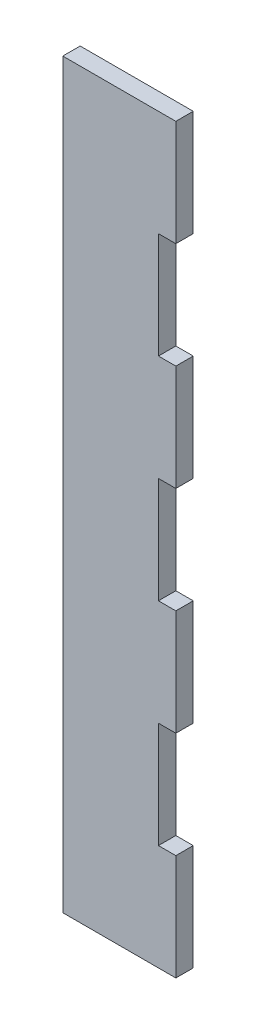
ISO-10303-21;
HEADER;
FILE_DESCRIPTION(('STEP AP214'),'2;1');
FILE_NAME('part.step','',(''),(''),'','','');
FILE_SCHEMA(('AUTOMOTIVE_DESIGN { 1 0 10303 214 1 1 1 1 }'));
ENDSEC;
DATA;
#1=APPLICATION_CONTEXT('core data for automotive mechanical design processes');
#2=APPLICATION_PROTOCOL_DEFINITION('international standard','automotive_design',2000,#1);
#3=PRODUCT_CONTEXT('',#1,'mechanical');
#4=PRODUCT('Part','Part','',(#3));
#5=PRODUCT_RELATED_PRODUCT_CATEGORY('part','',(#4));
#6=PRODUCT_DEFINITION_FORMATION('','',#4);
#7=PRODUCT_DEFINITION_CONTEXT('part definition',#1,'design');
#8=PRODUCT_DEFINITION('design','',#6,#7);
#9=PRODUCT_DEFINITION_SHAPE('','',#8);
#10=(LENGTH_UNIT() NAMED_UNIT(*) SI_UNIT(.MILLI.,.METRE.));
#11=(NAMED_UNIT(*) PLANE_ANGLE_UNIT() SI_UNIT($,.RADIAN.));
#12=(NAMED_UNIT(*) SI_UNIT($,.STERADIAN.) SOLID_ANGLE_UNIT());
#13=UNCERTAINTY_MEASURE_WITH_UNIT(LENGTH_MEASURE(1.E-05),#10,'distance_accuracy_value','');
#14=(GEOMETRIC_REPRESENTATION_CONTEXT(3) GLOBAL_UNCERTAINTY_ASSIGNED_CONTEXT((#13)) GLOBAL_UNIT_ASSIGNED_CONTEXT((#10,
#11,#12)) REPRESENTATION_CONTEXT('',''));
#15=CARTESIAN_POINT('',(0.,0.,0.));
#16=DIRECTION('',(0.,0.,1.));
#17=DIRECTION('',(1.,0.,0.));
#18=AXIS2_PLACEMENT_3D('',#15,#16,#17);
#19=CARTESIAN_POINT('',(0.,-101.6,4.7625));
#20=DIRECTION('',(0.,1.,0.));
#21=DIRECTION('',(0.,0.,1.));
#22=AXIS2_PLACEMENT_3D('',#19,#20,#21);
#23=PLANE('',#22);
#24=DIRECTION('',(1.,0.,0.));
#25=VECTOR('',#24,1.);
#26=CARTESIAN_POINT('',(0.,-101.6,0.));
#27=LINE('',#26,#25);
#28=CARTESIAN_POINT('',(-19.85,-101.6,0.));
#29=VERTEX_POINT('',#28);
#30=CARTESIAN_POINT('',(11.1125000000018,-101.6,0.));
#31=VERTEX_POINT('',#30);
#32=EDGE_CURVE('E212',#29,#31,#27,.T.);
#33=ORIENTED_EDGE('',*,*,#32,.T.);
#34=DIRECTION('',(0.,0.,-1.));
#35=VECTOR('',#34,1.);
#36=CARTESIAN_POINT('',(11.1125000000018,-101.6,4.7625));
#37=LINE('',#36,#35);
#38=CARTESIAN_POINT('',(11.1125000000018,-101.6,4.7625));
#39=VERTEX_POINT('',#38);
#40=EDGE_CURVE('E11',#39,#31,#37,.T.);
#41=ORIENTED_EDGE('',*,*,#40,.F.);
#42=DIRECTION('',(1.,0.,0.));
#43=VECTOR('',#42,1.);
#44=CARTESIAN_POINT('',(0.,-101.6,4.7625));
#45=LINE('',#44,#43);
#46=CARTESIAN_POINT('',(-19.85,-101.6,4.7625));
#47=VERTEX_POINT('',#46);
#48=EDGE_CURVE('E116',#47,#39,#45,.T.);
#49=ORIENTED_EDGE('',*,*,#48,.F.);
#50=DIRECTION('',(0.,0.,1.));
#51=VECTOR('',#50,1.);
#52=CARTESIAN_POINT('',(-19.85,-101.6,4.7625));
#53=LINE('',#52,#51);
#54=EDGE_CURVE('E208',#29,#47,#53,.T.);
#55=ORIENTED_EDGE('',*,*,#54,.F.);
#56=EDGE_LOOP('',(#33,#41,#49,#55));
#57=FACE_BOUND('',#56,.T.);
#58=ADVANCED_FACE('F41',(#57),#23,.F.);
#59=CARTESIAN_POINT('',(11.1125000000018,0.,4.7625));
#60=DIRECTION('',(1.,0.,0.));
#61=DIRECTION('',(0.,0.,-1.));
#62=AXIS2_PLACEMENT_3D('',#59,#60,#61);
#63=PLANE('',#62);
#64=DIRECTION('',(0.,-1.,0.));
#65=VECTOR('',#64,1.);
#66=CARTESIAN_POINT('',(11.1125000000018,0.,0.));
#67=LINE('',#66,#65);
#68=CARTESIAN_POINT('',(11.1125000000015,-72.5714285714286,0.));
#69=VERTEX_POINT('',#68);
#70=EDGE_CURVE('E289',#69,#31,#67,.T.);
#71=ORIENTED_EDGE('',*,*,#70,.F.);
#72=DIRECTION('',(0.,0.,-1.));
#73=VECTOR('',#72,1.);
#74=CARTESIAN_POINT('',(11.1125000000015,-72.5714285714286,4.7625));
#75=LINE('',#74,#73);
#76=CARTESIAN_POINT('',(11.1125000000015,-72.5714285714286,4.7625));
#77=VERTEX_POINT('',#76);
#78=EDGE_CURVE('E50',#77,#69,#75,.T.);
#79=ORIENTED_EDGE('',*,*,#78,.F.);
#80=DIRECTION('',(0.,-1.,0.));
#81=VECTOR('',#80,1.);
#82=CARTESIAN_POINT('',(11.1125000000018,0.,4.7625));
#83=LINE('',#82,#81);
#84=EDGE_CURVE('E198',#77,#39,#83,.T.);
#85=ORIENTED_EDGE('',*,*,#84,.T.);
#86=ORIENTED_EDGE('',*,*,#40,.T.);
#87=EDGE_LOOP('',(#71,#79,#85,#86));
#88=FACE_BOUND('',#87,.T.);
#89=ADVANCED_FACE('F290',(#88),#63,.T.);
#90=CARTESIAN_POINT('',(0.,-72.5714285714286,4.7625));
#91=DIRECTION('',(0.,1.,0.));
#92=DIRECTION('',(0.,0.,1.));
#93=AXIS2_PLACEMENT_3D('',#90,#91,#92);
#94=PLANE('',#93);
#95=DIRECTION('',(1.,0.,0.));
#96=VECTOR('',#95,1.);
#97=CARTESIAN_POINT('',(0.,-72.5714285714286,0.));
#98=LINE('',#97,#96);
#99=CARTESIAN_POINT('',(6.35,-72.5714285714286,0.));
#100=VERTEX_POINT('',#99);
#101=EDGE_CURVE('E286',#100,#69,#98,.T.);
#102=ORIENTED_EDGE('',*,*,#101,.F.);
#103=DIRECTION('',(0.,0.,-1.));
#104=VECTOR('',#103,1.);
#105=CARTESIAN_POINT('',(6.35,-72.5714285714286,4.7625));
#106=LINE('',#105,#104);
#107=CARTESIAN_POINT('',(6.35,-72.5714285714286,4.7625));
#108=VERTEX_POINT('',#107);
#109=EDGE_CURVE('E279',#108,#100,#106,.T.);
#110=ORIENTED_EDGE('',*,*,#109,.F.);
#111=DIRECTION('',(1.,0.,0.));
#112=VECTOR('',#111,1.);
#113=CARTESIAN_POINT('',(0.,-72.5714285714286,4.7625));
#114=LINE('',#113,#112);
#115=EDGE_CURVE('E191',#108,#77,#114,.T.);
#116=ORIENTED_EDGE('',*,*,#115,.T.);
#117=ORIENTED_EDGE('',*,*,#78,.T.);
#118=EDGE_LOOP('',(#102,#110,#116,#117));
#119=FACE_BOUND('',#118,.T.);
#120=ADVANCED_FACE('F284',(#119),#94,.T.);
#121=CARTESIAN_POINT('',(6.35,0.,4.7625));
#122=DIRECTION('',(1.,0.,0.));
#123=DIRECTION('',(0.,0.,-1.));
#124=AXIS2_PLACEMENT_3D('',#121,#122,#123);
#125=PLANE('',#124);
#126=DIRECTION('',(0.,-1.,0.));
#127=VECTOR('',#126,1.);
#128=CARTESIAN_POINT('',(6.35,0.,0.));
#129=LINE('',#128,#127);
#130=CARTESIAN_POINT('',(6.35,-43.5428571428572,0.));
#131=VERTEX_POINT('',#130);
#132=EDGE_CURVE('E296',#131,#100,#129,.T.);
#133=ORIENTED_EDGE('',*,*,#132,.F.);
#134=DIRECTION('',(0.,0.,-1.));
#135=VECTOR('',#134,1.);
#136=CARTESIAN_POINT('',(6.35,-43.5428571428572,4.7625));
#137=LINE('',#136,#135);
#138=CARTESIAN_POINT('',(6.35,-43.5428571428572,4.7625));
#139=VERTEX_POINT('',#138);
#140=EDGE_CURVE('E276',#139,#131,#137,.T.);
#141=ORIENTED_EDGE('',*,*,#140,.F.);
#142=DIRECTION('',(0.,-1.,0.));
#143=VECTOR('',#142,1.);
#144=CARTESIAN_POINT('',(6.35,0.,4.7625));
#145=LINE('',#144,#143);
#146=EDGE_CURVE('E178',#139,#108,#145,.T.);
#147=ORIENTED_EDGE('',*,*,#146,.T.);
#148=ORIENTED_EDGE('',*,*,#109,.T.);
#149=EDGE_LOOP('',(#133,#141,#147,#148));
#150=FACE_BOUND('',#149,.T.);
#151=ADVANCED_FACE('F349',(#150),#125,.T.);
#152=CARTESIAN_POINT('',(0.,-43.5428571428572,4.7625));
#153=DIRECTION('',(0.,1.,0.));
#154=DIRECTION('',(0.,0.,1.));
#155=AXIS2_PLACEMENT_3D('',#152,#153,#154);
#156=PLANE('',#155);
#157=DIRECTION('',(1.,0.,0.));
#158=VECTOR('',#157,1.);
#159=CARTESIAN_POINT('',(0.,-43.5428571428572,0.));
#160=LINE('',#159,#158);
#161=CARTESIAN_POINT('',(11.1125000000012,-43.5428571428572,0.));
#162=VERTEX_POINT('',#161);
#163=EDGE_CURVE('E300',#131,#162,#160,.T.);
#164=ORIENTED_EDGE('',*,*,#163,.T.);
#165=DIRECTION('',(0.,0.,-1.));
#166=VECTOR('',#165,1.);
#167=CARTESIAN_POINT('',(11.1125000000012,-43.5428571428572,4.7625));
#168=LINE('',#167,#166);
#169=CARTESIAN_POINT('',(11.1125000000012,-43.5428571428572,4.7625));
#170=VERTEX_POINT('',#169);
#171=EDGE_CURVE('E273',#170,#162,#168,.T.);
#172=ORIENTED_EDGE('',*,*,#171,.F.);
#173=DIRECTION('',(1.,0.,0.));
#174=VECTOR('',#173,1.);
#175=CARTESIAN_POINT('',(0.,-43.5428571428572,4.7625));
#176=LINE('',#175,#174);
#177=EDGE_CURVE('E190',#139,#170,#176,.T.);
#178=ORIENTED_EDGE('',*,*,#177,.F.);
#179=ORIENTED_EDGE('',*,*,#140,.T.);
#180=EDGE_LOOP('',(#164,#172,#178,#179));
#181=FACE_BOUND('',#180,.T.);
#182=ADVANCED_FACE('F351',(#181),#156,.F.);
#183=CARTESIAN_POINT('',(11.1125000000012,0.,4.7625));
#184=DIRECTION('',(1.,0.,0.));
#185=DIRECTION('',(0.,0.,-1.));
#186=AXIS2_PLACEMENT_3D('',#183,#184,#185);
#187=PLANE('',#186);
#188=DIRECTION('',(0.,-1.,0.));
#189=VECTOR('',#188,1.);
#190=CARTESIAN_POINT('',(11.1125000000012,0.,0.));
#191=LINE('',#190,#189);
#192=CARTESIAN_POINT('',(11.1125000000009,-14.5142857142858,0.));
#193=VERTEX_POINT('',#192);
#194=EDGE_CURVE('E308',#193,#162,#191,.T.);
#195=ORIENTED_EDGE('',*,*,#194,.F.);
#196=DIRECTION('',(0.,0.,-1.));
#197=VECTOR('',#196,1.);
#198=CARTESIAN_POINT('',(11.1125000000009,-14.5142857142858,4.7625));
#199=LINE('',#198,#197);
#200=CARTESIAN_POINT('',(11.1125000000009,-14.5142857142858,4.7625));
#201=VERTEX_POINT('',#200);
#202=EDGE_CURVE('E270',#201,#193,#199,.T.);
#203=ORIENTED_EDGE('',*,*,#202,.F.);
#204=DIRECTION('',(0.,-1.,0.));
#205=VECTOR('',#204,1.);
#206=CARTESIAN_POINT('',(11.1125000000012,0.,4.7625));
#207=LINE('',#206,#205);
#208=EDGE_CURVE('E196',#201,#170,#207,.T.);
#209=ORIENTED_EDGE('',*,*,#208,.T.);
#210=ORIENTED_EDGE('',*,*,#171,.T.);
#211=EDGE_LOOP('',(#195,#203,#209,#210));
#212=FACE_BOUND('',#211,.T.);
#213=ADVANCED_FACE('F346',(#212),#187,.T.);
#214=CARTESIAN_POINT('',(0.,-14.5142857142858,4.7625));
#215=DIRECTION('',(0.,1.,0.));
#216=DIRECTION('',(0.,0.,1.));
#217=AXIS2_PLACEMENT_3D('',#214,#215,#216);
#218=PLANE('',#217);
#219=DIRECTION('',(1.,0.,0.));
#220=VECTOR('',#219,1.);
#221=CARTESIAN_POINT('',(0.,-14.5142857142858,0.));
#222=LINE('',#221,#220);
#223=CARTESIAN_POINT('',(6.35,-14.5142857142858,0.));
#224=VERTEX_POINT('',#223);
#225=EDGE_CURVE('E312',#224,#193,#222,.T.);
#226=ORIENTED_EDGE('',*,*,#225,.F.);
#227=DIRECTION('',(0.,0.,-1.));
#228=VECTOR('',#227,1.);
#229=CARTESIAN_POINT('',(6.35,-14.5142857142858,4.7625));
#230=LINE('',#229,#228);
#231=CARTESIAN_POINT('',(6.35,-14.5142857142858,4.7625));
#232=VERTEX_POINT('',#231);
#233=EDGE_CURVE('E267',#232,#224,#230,.T.);
#234=ORIENTED_EDGE('',*,*,#233,.F.);
#235=DIRECTION('',(1.,0.,0.));
#236=VECTOR('',#235,1.);
#237=CARTESIAN_POINT('',(0.,-14.5142857142858,4.7625));
#238=LINE('',#237,#236);
#239=EDGE_CURVE('E187',#232,#201,#238,.T.);
#240=ORIENTED_EDGE('',*,*,#239,.T.);
#241=ORIENTED_EDGE('',*,*,#202,.T.);
#242=EDGE_LOOP('',(#226,#234,#240,#241));
#243=FACE_BOUND('',#242,.T.);
#244=ADVANCED_FACE('F341',(#243),#218,.T.);
#245=CARTESIAN_POINT('',(6.35,14.5142857142857,0.));
#246=VERTEX_POINT('',#245);
#247=EDGE_CURVE('E302',#246,#224,#129,.T.);
#248=ORIENTED_EDGE('',*,*,#247,.F.);
#249=DIRECTION('',(0.,0.,-1.));
#250=VECTOR('',#249,1.);
#251=CARTESIAN_POINT('',(6.35,14.5142857142857,4.7625));
#252=LINE('',#251,#250);
#253=CARTESIAN_POINT('',(6.35,14.5142857142857,4.7625));
#254=VERTEX_POINT('',#253);
#255=EDGE_CURVE('E264',#254,#246,#252,.T.);
#256=ORIENTED_EDGE('',*,*,#255,.F.);
#257=EDGE_CURVE('E177',#254,#232,#145,.T.);
#258=ORIENTED_EDGE('',*,*,#257,.T.);
#259=ORIENTED_EDGE('',*,*,#233,.T.);
#260=EDGE_LOOP('',(#248,#256,#258,#259));
#261=FACE_BOUND('',#260,.T.);
#262=ADVANCED_FACE('F335',(#261),#125,.T.);
#263=CARTESIAN_POINT('',(0.,14.5142857142857,4.7625));
#264=DIRECTION('',(0.,1.,0.));
#265=DIRECTION('',(0.,0.,1.));
#266=AXIS2_PLACEMENT_3D('',#263,#264,#265);
#267=PLANE('',#266);
#268=DIRECTION('',(1.,0.,0.));
#269=VECTOR('',#268,1.);
#270=CARTESIAN_POINT('',(0.,14.5142857142857,0.));
#271=LINE('',#270,#269);
#272=CARTESIAN_POINT('',(11.1125000000006,14.5142857142857,0.));
#273=VERTEX_POINT('',#272);
#274=EDGE_CURVE('E316',#246,#273,#271,.T.);
#275=ORIENTED_EDGE('',*,*,#274,.T.);
#276=DIRECTION('',(0.,0.,-1.));
#277=VECTOR('',#276,1.);
#278=CARTESIAN_POINT('',(11.1125000000006,14.5142857142857,4.7625));
#279=LINE('',#278,#277);
#280=CARTESIAN_POINT('',(11.1125000000006,14.5142857142857,4.7625));
#281=VERTEX_POINT('',#280);
#282=EDGE_CURVE('E261',#281,#273,#279,.T.);
#283=ORIENTED_EDGE('',*,*,#282,.F.);
#284=DIRECTION('',(1.,0.,0.));
#285=VECTOR('',#284,1.);
#286=CARTESIAN_POINT('',(0.,14.5142857142857,4.7625));
#287=LINE('',#286,#285);
#288=EDGE_CURVE('E186',#254,#281,#287,.T.);
#289=ORIENTED_EDGE('',*,*,#288,.F.);
#290=ORIENTED_EDGE('',*,*,#255,.T.);
#291=EDGE_LOOP('',(#275,#283,#289,#290));
#292=FACE_BOUND('',#291,.T.);
#293=ADVANCED_FACE('F383',(#292),#267,.F.);
#294=CARTESIAN_POINT('',(11.1125000000006,0.,4.7625));
#295=DIRECTION('',(1.,0.,0.));
#296=DIRECTION('',(0.,0.,-1.));
#297=AXIS2_PLACEMENT_3D('',#294,#295,#296);
#298=PLANE('',#297);
#299=DIRECTION('',(0.,-1.,0.));
#300=VECTOR('',#299,1.);
#301=CARTESIAN_POINT('',(11.1125000000006,0.,0.));
#302=LINE('',#301,#300);
#303=CARTESIAN_POINT('',(11.1125000000003,43.5428571428571,0.));
#304=VERTEX_POINT('',#303);
#305=EDGE_CURVE('E320',#304,#273,#302,.T.);
#306=ORIENTED_EDGE('',*,*,#305,.F.);
#307=DIRECTION('',(0.,0.,-1.));
#308=VECTOR('',#307,1.);
#309=CARTESIAN_POINT('',(11.1125000000003,43.5428571428571,4.7625));
#310=LINE('',#309,#308);
#311=CARTESIAN_POINT('',(11.1125000000003,43.5428571428571,4.7625));
#312=VERTEX_POINT('',#311);
#313=EDGE_CURVE('E258',#312,#304,#310,.T.);
#314=ORIENTED_EDGE('',*,*,#313,.F.);
#315=DIRECTION('',(0.,-1.,0.));
#316=VECTOR('',#315,1.);
#317=CARTESIAN_POINT('',(11.1125000000006,0.,4.7625));
#318=LINE('',#317,#316);
#319=EDGE_CURVE('E180',#312,#281,#318,.T.);
#320=ORIENTED_EDGE('',*,*,#319,.T.);
#321=ORIENTED_EDGE('',*,*,#282,.T.);
#322=EDGE_LOOP('',(#306,#314,#320,#321));
#323=FACE_BOUND('',#322,.T.);
#324=ADVANCED_FACE('F386',(#323),#298,.T.);
#325=CARTESIAN_POINT('',(0.,43.5428571428571,4.7625));
#326=DIRECTION('',(0.,1.,0.));
#327=DIRECTION('',(0.,0.,1.));
#328=AXIS2_PLACEMENT_3D('',#325,#326,#327);
#329=PLANE('',#328);
#330=DIRECTION('',(1.,0.,0.));
#331=VECTOR('',#330,1.);
#332=CARTESIAN_POINT('',(0.,43.5428571428571,0.));
#333=LINE('',#332,#331);
#334=CARTESIAN_POINT('',(6.35,43.5428571428571,0.));
#335=VERTEX_POINT('',#334);
#336=EDGE_CURVE('E324',#335,#304,#333,.T.);
#337=ORIENTED_EDGE('',*,*,#336,.F.);
#338=DIRECTION('',(0.,0.,-1.));
#339=VECTOR('',#338,1.);
#340=CARTESIAN_POINT('',(6.35,43.5428571428571,4.7625));
#341=LINE('',#340,#339);
#342=CARTESIAN_POINT('',(6.35,43.5428571428571,4.7625));
#343=VERTEX_POINT('',#342);
#344=EDGE_CURVE('E163',#343,#335,#341,.T.);
#345=ORIENTED_EDGE('',*,*,#344,.F.);
#346=DIRECTION('',(1.,0.,0.));
#347=VECTOR('',#346,1.);
#348=CARTESIAN_POINT('',(0.,43.5428571428571,4.7625));
#349=LINE('',#348,#347);
#350=EDGE_CURVE('E174',#343,#312,#349,.T.);
#351=ORIENTED_EDGE('',*,*,#350,.T.);
#352=ORIENTED_EDGE('',*,*,#313,.T.);
#353=EDGE_LOOP('',(#337,#345,#351,#352));
#354=FACE_BOUND('',#353,.T.);
#355=ADVANCED_FACE('F390',(#354),#329,.T.);
#356=CARTESIAN_POINT('',(6.35,72.5714285714285,0.));
#357=VERTEX_POINT('',#356);
#358=EDGE_CURVE('E159',#357,#335,#129,.T.);
#359=ORIENTED_EDGE('',*,*,#358,.F.);
#360=DIRECTION('',(0.,0.,-1.));
#361=VECTOR('',#360,1.);
#362=CARTESIAN_POINT('',(6.35,72.5714285714285,4.7625));
#363=LINE('',#362,#361);
#364=CARTESIAN_POINT('',(6.35,72.5714285714285,4.7625));
#365=VERTEX_POINT('',#364);
#366=EDGE_CURVE('E153',#365,#357,#363,.T.);
#367=ORIENTED_EDGE('',*,*,#366,.F.);
#368=EDGE_CURVE('E157',#365,#343,#145,.T.);
#369=ORIENTED_EDGE('',*,*,#368,.T.);
#370=ORIENTED_EDGE('',*,*,#344,.T.);
#371=EDGE_LOOP('',(#359,#367,#369,#370));
#372=FACE_BOUND('',#371,.T.);
#373=ADVANCED_FACE('F155',(#372),#125,.T.);
#374=CARTESIAN_POINT('',(0.,72.5714285714285,4.7625));
#375=DIRECTION('',(0.,1.,0.));
#376=DIRECTION('',(0.,0.,1.));
#377=AXIS2_PLACEMENT_3D('',#374,#375,#376);
#378=PLANE('',#377);
#379=DIRECTION('',(1.,0.,0.));
#380=VECTOR('',#379,1.);
#381=CARTESIAN_POINT('',(0.,72.5714285714285,0.));
#382=LINE('',#381,#380);
#383=CARTESIAN_POINT('',(11.1125,72.5714285714285,0.));
#384=VERTEX_POINT('',#383);
#385=EDGE_CURVE('E248',#357,#384,#382,.T.);
#386=ORIENTED_EDGE('',*,*,#385,.T.);
#387=DIRECTION('',(0.,0.,-1.));
#388=VECTOR('',#387,1.);
#389=CARTESIAN_POINT('',(11.1125,72.5714285714285,4.7625));
#390=LINE('',#389,#388);
#391=CARTESIAN_POINT('',(11.1125,72.5714285714285,4.7625));
#392=VERTEX_POINT('',#391);
#393=EDGE_CURVE('E103',#392,#384,#390,.T.);
#394=ORIENTED_EDGE('',*,*,#393,.F.);
#395=DIRECTION('',(1.,0.,0.));
#396=VECTOR('',#395,1.);
#397=CARTESIAN_POINT('',(0.,72.5714285714285,4.7625));
#398=LINE('',#397,#396);
#399=EDGE_CURVE('E165',#365,#392,#398,.T.);
#400=ORIENTED_EDGE('',*,*,#399,.F.);
#401=ORIENTED_EDGE('',*,*,#366,.T.);
#402=EDGE_LOOP('',(#386,#394,#400,#401));
#403=FACE_BOUND('',#402,.T.);
#404=ADVANCED_FACE('F166',(#403),#378,.F.);
#405=CARTESIAN_POINT('',(11.1125,0.,4.7625));
#406=DIRECTION('',(1.,0.,0.));
#407=DIRECTION('',(0.,0.,-1.));
#408=AXIS2_PLACEMENT_3D('',#405,#406,#407);
#409=PLANE('',#408);
#410=DIRECTION('',(0.,-1.,0.));
#411=VECTOR('',#410,1.);
#412=CARTESIAN_POINT('',(11.1125,0.,0.));
#413=LINE('',#412,#411);
#414=CARTESIAN_POINT('',(11.1125,101.6,0.));
#415=VERTEX_POINT('',#414);
#416=EDGE_CURVE('E245',#415,#384,#413,.T.);
#417=ORIENTED_EDGE('',*,*,#416,.F.);
#418=DIRECTION('',(0.,0.,-1.));
#419=VECTOR('',#418,1.);
#420=CARTESIAN_POINT('',(11.1125,101.6,4.7625));
#421=LINE('',#420,#419);
#422=CARTESIAN_POINT('',(11.1125,101.6,4.7625));
#423=VERTEX_POINT('',#422);
#424=EDGE_CURVE('E58',#423,#415,#421,.T.);
#425=ORIENTED_EDGE('',*,*,#424,.F.);
#426=DIRECTION('',(0.,-1.,0.));
#427=VECTOR('',#426,1.);
#428=CARTESIAN_POINT('',(11.1125,0.,4.7625));
#429=LINE('',#428,#427);
#430=EDGE_CURVE('E168',#423,#392,#429,.T.);
#431=ORIENTED_EDGE('',*,*,#430,.T.);
#432=ORIENTED_EDGE('',*,*,#393,.T.);
#433=EDGE_LOOP('',(#417,#425,#431,#432));
#434=FACE_BOUND('',#433,.T.);
#435=ADVANCED_FACE('F399',(#434),#409,.T.);
#436=CARTESIAN_POINT('',(0.,101.6,4.7625));
#437=DIRECTION('',(0.,1.,0.));
#438=DIRECTION('',(0.,0.,1.));
#439=AXIS2_PLACEMENT_3D('',#436,#437,#438);
#440=PLANE('',#439);
#441=DIRECTION('',(1.,0.,0.));
#442=VECTOR('',#441,1.);
#443=CARTESIAN_POINT('',(0.,101.6,0.));
#444=LINE('',#443,#442);
#445=CARTESIAN_POINT('',(-19.85,101.6,0.));
#446=VERTEX_POINT('',#445);
#447=EDGE_CURVE('E207',#446,#415,#444,.T.);
#448=ORIENTED_EDGE('',*,*,#447,.F.);
#449=DIRECTION('',(0.,0.,-1.));
#450=VECTOR('',#449,1.);
#451=CARTESIAN_POINT('',(-19.85,101.6,4.7625));
#452=LINE('',#451,#450);
#453=CARTESIAN_POINT('',(-19.85,101.6,4.7625));
#454=VERTEX_POINT('',#453);
#455=EDGE_CURVE('E217',#454,#446,#452,.T.);
#456=ORIENTED_EDGE('',*,*,#455,.F.);
#457=DIRECTION('',(1.,0.,0.));
#458=VECTOR('',#457,1.);
#459=CARTESIAN_POINT('',(0.,101.6,4.7625));
#460=LINE('',#459,#458);
#461=EDGE_CURVE('E233',#454,#423,#460,.T.);
#462=ORIENTED_EDGE('',*,*,#461,.T.);
#463=ORIENTED_EDGE('',*,*,#424,.T.);
#464=EDGE_LOOP('',(#448,#456,#462,#463));
#465=FACE_BOUND('',#464,.T.);
#466=ADVANCED_FACE('F242',(#465),#440,.T.);
#467=CARTESIAN_POINT('',(0.,0.,4.7625));
#468=DIRECTION('',(0.,0.,1.));
#469=DIRECTION('',(1.,0.,0.));
#470=AXIS2_PLACEMENT_3D('',#467,#468,#469);
#471=PLANE('',#470);
#472=ORIENTED_EDGE('',*,*,#48,.T.);
#473=ORIENTED_EDGE('',*,*,#84,.F.);
#474=ORIENTED_EDGE('',*,*,#115,.F.);
#475=ORIENTED_EDGE('',*,*,#146,.F.);
#476=ORIENTED_EDGE('',*,*,#177,.T.);
#477=ORIENTED_EDGE('',*,*,#208,.F.);
#478=ORIENTED_EDGE('',*,*,#239,.F.);
#479=ORIENTED_EDGE('',*,*,#257,.F.);
#480=ORIENTED_EDGE('',*,*,#288,.T.);
#481=ORIENTED_EDGE('',*,*,#319,.F.);
#482=ORIENTED_EDGE('',*,*,#350,.F.);
#483=ORIENTED_EDGE('',*,*,#368,.F.);
#484=ORIENTED_EDGE('',*,*,#399,.T.);
#485=ORIENTED_EDGE('',*,*,#430,.F.);
#486=ORIENTED_EDGE('',*,*,#461,.F.);
#487=DIRECTION('',(0.,1.,0.));
#488=VECTOR('',#487,1.);
#489=CARTESIAN_POINT('',(-19.85,-101.6,4.7625));
#490=LINE('',#489,#488);
#491=EDGE_CURVE('E221',#47,#454,#490,.T.);
#492=ORIENTED_EDGE('',*,*,#491,.F.);
#493=EDGE_LOOP('',(#472,#473,#474,#475,#476,#477,#478,#479,#480,#481,#482,#483,#484,#485,#486,#492));
#494=FACE_BOUND('',#493,.T.);
#495=ADVANCED_FACE('F171',(#494),#471,.T.);
#496=CARTESIAN_POINT('',(0.,0.,0.));
#497=DIRECTION('',(0.,0.,1.));
#498=DIRECTION('',(1.,0.,0.));
#499=AXIS2_PLACEMENT_3D('',#496,#497,#498);
#500=PLANE('',#499);
#501=ORIENTED_EDGE('',*,*,#32,.F.);
#502=DIRECTION('',(0.,-1.,0.));
#503=VECTOR('',#502,1.);
#504=CARTESIAN_POINT('',(-19.85,-101.6,0.));
#505=LINE('',#504,#503);
#506=EDGE_CURVE('E213',#446,#29,#505,.T.);
#507=ORIENTED_EDGE('',*,*,#506,.F.);
#508=ORIENTED_EDGE('',*,*,#447,.T.);
#509=ORIENTED_EDGE('',*,*,#416,.T.);
#510=ORIENTED_EDGE('',*,*,#385,.F.);
#511=ORIENTED_EDGE('',*,*,#358,.T.);
#512=ORIENTED_EDGE('',*,*,#336,.T.);
#513=ORIENTED_EDGE('',*,*,#305,.T.);
#514=ORIENTED_EDGE('',*,*,#274,.F.);
#515=ORIENTED_EDGE('',*,*,#247,.T.);
#516=ORIENTED_EDGE('',*,*,#225,.T.);
#517=ORIENTED_EDGE('',*,*,#194,.T.);
#518=ORIENTED_EDGE('',*,*,#163,.F.);
#519=ORIENTED_EDGE('',*,*,#132,.T.);
#520=ORIENTED_EDGE('',*,*,#101,.T.);
#521=ORIENTED_EDGE('',*,*,#70,.T.);
#522=EDGE_LOOP('',(#501,#507,#508,#509,#510,#511,#512,#513,#514,#515,#516,#517,#518,#519,#520,#521));
#523=FACE_BOUND('',#522,.T.);
#524=ADVANCED_FACE('F293',(#523),#500,.F.);
#525=CARTESIAN_POINT('',(-19.85,0.,0.));
#526=DIRECTION('',(-1.,0.,0.));
#527=DIRECTION('',(0.,0.,1.));
#528=AXIS2_PLACEMENT_3D('',#525,#526,#527);
#529=PLANE('',#528);
#530=ORIENTED_EDGE('',*,*,#491,.T.);
#531=ORIENTED_EDGE('',*,*,#455,.T.);
#532=ORIENTED_EDGE('',*,*,#506,.T.);
#533=ORIENTED_EDGE('',*,*,#54,.T.);
#534=EDGE_LOOP('',(#530,#531,#532,#533));
#535=FACE_BOUND('',#534,.T.);
#536=ADVANCED_FACE('F226',(#535),#529,.T.);
#537=CLOSED_SHELL('',(#58,#89,#120,#151,#182,#213,#244,#262,#293,#324,#355,#373,#404,#435,#466,
#495,#524,#536));
#538=MANIFOLD_SOLID_BREP('B2',#537);
#539=ADVANCED_BREP_SHAPE_REPRESENTATION('',(#18,#538),#14);
#540=SHAPE_DEFINITION_REPRESENTATION(#9,#539);
ENDSEC;
END-ISO-10303-21;
